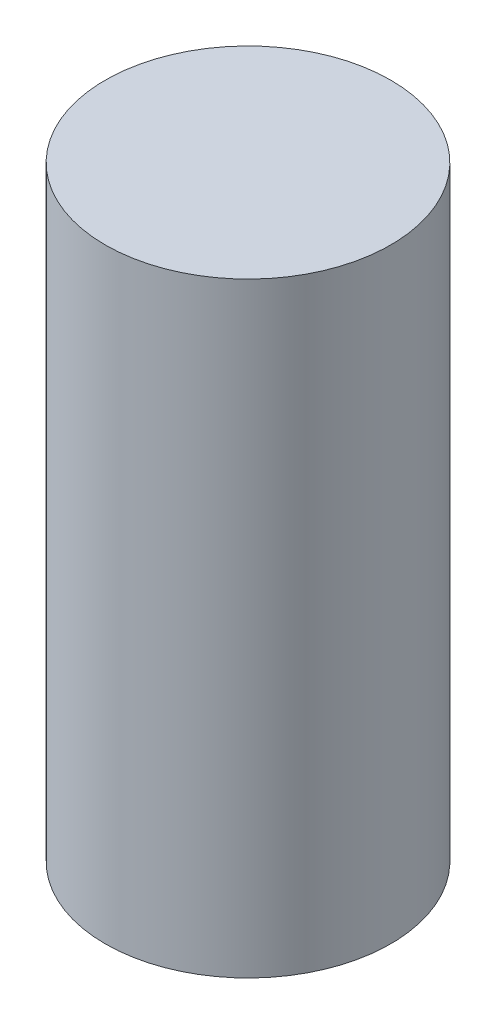
ISO-10303-21;
HEADER;
FILE_DESCRIPTION(('STEP AP214'),'2;1');
FILE_NAME('part.step','',(''),(''),'','','');
FILE_SCHEMA(('AUTOMOTIVE_DESIGN { 1 0 10303 214 1 1 1 1 }'));
ENDSEC;
DATA;
#1=APPLICATION_CONTEXT('core data for automotive mechanical design processes');
#2=APPLICATION_PROTOCOL_DEFINITION('international standard','automotive_design',2000,#1);
#3=PRODUCT_CONTEXT('',#1,'mechanical');
#4=PRODUCT('Part','Part','',(#3));
#5=PRODUCT_RELATED_PRODUCT_CATEGORY('part','',(#4));
#6=PRODUCT_DEFINITION_FORMATION('','',#4);
#7=PRODUCT_DEFINITION_CONTEXT('part definition',#1,'design');
#8=PRODUCT_DEFINITION('design','',#6,#7);
#9=PRODUCT_DEFINITION_SHAPE('','',#8);
#10=(LENGTH_UNIT() NAMED_UNIT(*) SI_UNIT(.MILLI.,.METRE.));
#11=(NAMED_UNIT(*) PLANE_ANGLE_UNIT() SI_UNIT($,.RADIAN.));
#12=(NAMED_UNIT(*) SI_UNIT($,.STERADIAN.) SOLID_ANGLE_UNIT());
#13=UNCERTAINTY_MEASURE_WITH_UNIT(LENGTH_MEASURE(1.E-05),#10,'distance_accuracy_value','');
#14=(GEOMETRIC_REPRESENTATION_CONTEXT(3) GLOBAL_UNCERTAINTY_ASSIGNED_CONTEXT((#13)) GLOBAL_UNIT_ASSIGNED_CONTEXT((#10,
#11,#12)) REPRESENTATION_CONTEXT('',''));
#15=CARTESIAN_POINT('',(0.,0.,0.));
#16=DIRECTION('',(0.,0.,1.));
#17=DIRECTION('',(1.,0.,0.));
#18=AXIS2_PLACEMENT_3D('',#15,#16,#17);
#19=CARTESIAN_POINT('',(0.,-212.,0.));
#20=DIRECTION('',(0.,1.,0.));
#21=DIRECTION('',(0.,0.,1.));
#22=AXIS2_PLACEMENT_3D('',#19,#20,#21);
#23=CYLINDRICAL_SURFACE('',#22,50.);
#24=CARTESIAN_POINT('',(0.,-212.,0.));
#25=DIRECTION('',(0.,1.,0.));
#26=DIRECTION('',(0.,0.,1.));
#27=AXIS2_PLACEMENT_3D('',#24,#25,#26);
#28=CIRCLE('',#27,50.);
#29=CARTESIAN_POINT('',(0.,-212.,50.));
#30=VERTEX_POINT('',#29);
#31=EDGE_CURVE('E10',#30,#30,#28,.T.);
#32=ORIENTED_EDGE('',*,*,#31,.T.);
#33=EDGE_LOOP('',(#32));
#34=FACE_BOUND('',#33,.T.);
#35=CARTESIAN_POINT('',(0.,0.,0.));
#36=DIRECTION('',(0.,1.,0.));
#37=DIRECTION('',(0.,0.,1.));
#38=AXIS2_PLACEMENT_3D('',#35,#36,#37);
#39=CIRCLE('',#38,50.);
#40=CARTESIAN_POINT('',(0.,0.,50.));
#41=VERTEX_POINT('',#40);
#42=EDGE_CURVE('E35',#41,#41,#39,.T.);
#43=ORIENTED_EDGE('',*,*,#42,.F.);
#44=EDGE_LOOP('',(#43));
#45=FACE_BOUND('',#44,.T.);
#46=ADVANCED_FACE('F32',(#34,#45),#23,.T.);
#47=CARTESIAN_POINT('',(0.,-212.,0.));
#48=DIRECTION('',(0.,1.,0.));
#49=DIRECTION('',(0.,0.,1.));
#50=AXIS2_PLACEMENT_3D('',#47,#48,#49);
#51=PLANE('',#50);
#52=ORIENTED_EDGE('',*,*,#31,.F.);
#53=EDGE_LOOP('',(#52));
#54=FACE_BOUND('',#53,.T.);
#55=ADVANCED_FACE('F47',(#54),#51,.F.);
#56=CARTESIAN_POINT('',(0.,0.,0.));
#57=DIRECTION('',(0.,1.,0.));
#58=DIRECTION('',(0.,0.,1.));
#59=AXIS2_PLACEMENT_3D('',#56,#57,#58);
#60=PLANE('',#59);
#61=ORIENTED_EDGE('',*,*,#42,.T.);
#62=EDGE_LOOP('',(#61));
#63=FACE_BOUND('',#62,.T.);
#64=ADVANCED_FACE('F44',(#63),#60,.T.);
#65=CLOSED_SHELL('',(#46,#55,#64));
#66=MANIFOLD_SOLID_BREP('B2',#65);
#67=ADVANCED_BREP_SHAPE_REPRESENTATION('',(#18,#66),#14);
#68=SHAPE_DEFINITION_REPRESENTATION(#9,#67);
ENDSEC;
END-ISO-10303-21;
